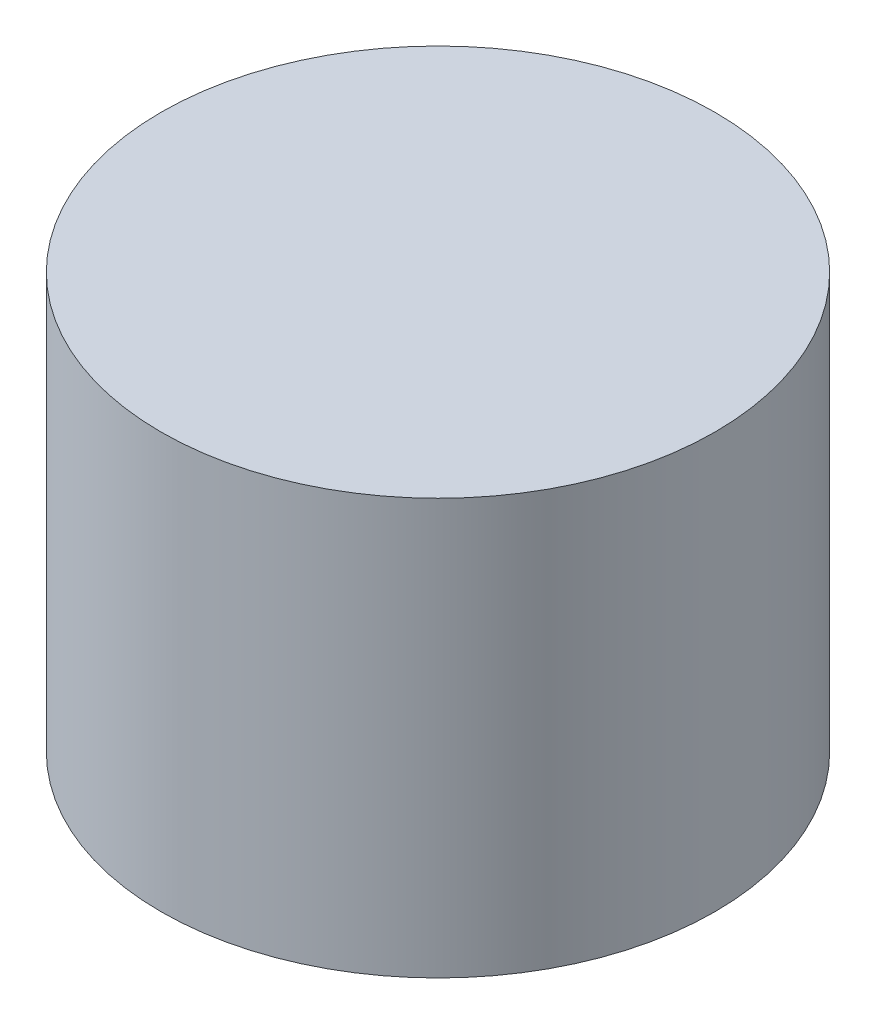
ISO-10303-21;
HEADER;
FILE_DESCRIPTION(('STEP AP214'),'2;1');
FILE_NAME('part.step','',(''),(''),'','','');
FILE_SCHEMA(('AUTOMOTIVE_DESIGN { 1 0 10303 214 1 1 1 1 }'));
ENDSEC;
DATA;
#1=APPLICATION_CONTEXT('core data for automotive mechanical design processes');
#2=APPLICATION_PROTOCOL_DEFINITION('international standard','automotive_design',2000,#1);
#3=PRODUCT_CONTEXT('',#1,'mechanical');
#4=PRODUCT('Part','Part','',(#3));
#5=PRODUCT_RELATED_PRODUCT_CATEGORY('part','',(#4));
#6=PRODUCT_DEFINITION_FORMATION('','',#4);
#7=PRODUCT_DEFINITION_CONTEXT('part definition',#1,'design');
#8=PRODUCT_DEFINITION('design','',#6,#7);
#9=PRODUCT_DEFINITION_SHAPE('','',#8);
#10=(LENGTH_UNIT() NAMED_UNIT(*) SI_UNIT(.MILLI.,.METRE.));
#11=(NAMED_UNIT(*) PLANE_ANGLE_UNIT() SI_UNIT($,.RADIAN.));
#12=(NAMED_UNIT(*) SI_UNIT($,.STERADIAN.) SOLID_ANGLE_UNIT());
#13=UNCERTAINTY_MEASURE_WITH_UNIT(LENGTH_MEASURE(1.E-05),#10,'distance_accuracy_value','');
#14=(GEOMETRIC_REPRESENTATION_CONTEXT(3) GLOBAL_UNCERTAINTY_ASSIGNED_CONTEXT((#13)) GLOBAL_UNIT_ASSIGNED_CONTEXT((#10,
#11,#12)) REPRESENTATION_CONTEXT('',''));
#15=CARTESIAN_POINT('',(0.,0.,0.));
#16=DIRECTION('',(0.,0.,1.));
#17=DIRECTION('',(1.,0.,0.));
#18=AXIS2_PLACEMENT_3D('',#15,#16,#17);
#19=CARTESIAN_POINT('',(0.,30.,0.));
#20=DIRECTION('',(0.,1.,0.));
#21=DIRECTION('',(0.,0.,-1.));
#22=AXIS2_PLACEMENT_3D('',#19,#20,#21);
#23=PLANE('',#22);
#24=CARTESIAN_POINT('',(0.,30.,0.));
#25=DIRECTION('',(0.,1.,0.));
#26=DIRECTION('',(1.,0.,0.));
#27=AXIS2_PLACEMENT_3D('',#24,#25,#26);
#28=CIRCLE('',#27,20.);
#29=CARTESIAN_POINT('',(-20.,30.,0.));
#30=VERTEX_POINT('',#29);
#31=EDGE_CURVE('E41',#30,#30,#28,.T.);
#32=ORIENTED_EDGE('',*,*,#31,.T.);
#33=EDGE_LOOP('',(#32));
#34=FACE_BOUND('',#33,.T.);
#35=ADVANCED_FACE('F15',(#34),#23,.T.);
#36=CARTESIAN_POINT('',(0.,0.,0.));
#37=DIRECTION('',(0.,-1.,0.));
#38=DIRECTION('',(-1.,0.,0.));
#39=AXIS2_PLACEMENT_3D('',#36,#37,#38);
#40=PLANE('',#39);
#41=CARTESIAN_POINT('',(0.,0.,0.));
#42=DIRECTION('',(0.,-1.,0.));
#43=DIRECTION('',(1.,0.,0.));
#44=AXIS2_PLACEMENT_3D('',#41,#42,#43);
#45=CIRCLE('',#44,20.);
#46=CARTESIAN_POINT('',(-20.,0.,0.));
#47=VERTEX_POINT('',#46);
#48=EDGE_CURVE('E9',#47,#47,#45,.T.);
#49=ORIENTED_EDGE('',*,*,#48,.T.);
#50=EDGE_LOOP('',(#49));
#51=FACE_BOUND('',#50,.T.);
#52=ADVANCED_FACE('F61',(#51),#40,.T.);
#53=CARTESIAN_POINT('',(0.,15.,0.));
#54=DIRECTION('',(0.,1.,0.));
#55=DIRECTION('',(1.,0.,0.));
#56=AXIS2_PLACEMENT_3D('',#53,#54,#55);
#57=CYLINDRICAL_SURFACE('',#56,20.);
#58=ORIENTED_EDGE('',*,*,#31,.F.);
#59=DIRECTION('',(0.,-1.,0.));
#60=VECTOR('',#59,1.);
#61=CARTESIAN_POINT('',(-20.,15.,0.));
#62=LINE('',#61,#60);
#63=EDGE_CURVE('E18',#30,#47,#62,.T.);
#64=ORIENTED_EDGE('',*,*,#63,.T.);
#65=ORIENTED_EDGE('',*,*,#48,.F.);
#66=ORIENTED_EDGE('',*,*,#63,.F.);
#67=EDGE_LOOP('',(#58,#64,#65,#66));
#68=FACE_BOUND('',#67,.T.);
#69=ADVANCED_FACE('F40',(#68),#57,.T.);
#70=CLOSED_SHELL('',(#35,#52,#69));
#71=MANIFOLD_SOLID_BREP('B1',#70);
#72=ADVANCED_BREP_SHAPE_REPRESENTATION('',(#18,#71),#14);
#73=SHAPE_DEFINITION_REPRESENTATION(#9,#72);
ENDSEC;
END-ISO-10303-21;
